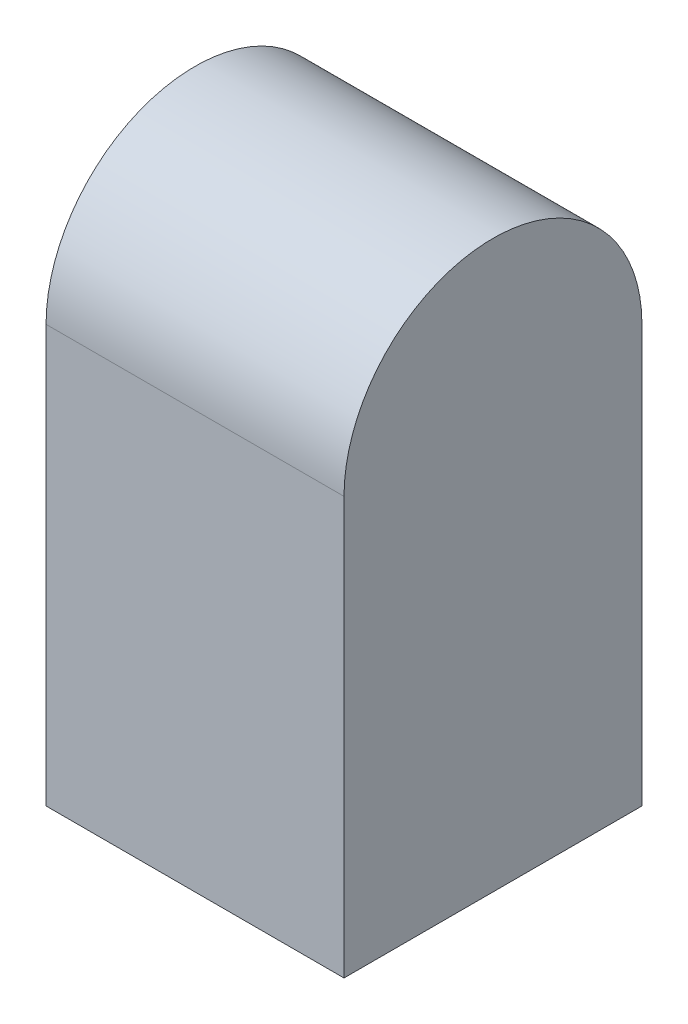
ISO-10303-21;
HEADER;
FILE_DESCRIPTION(('STEP AP214'),'2;1');
FILE_NAME('part.step','',(''),(''),'','','');
FILE_SCHEMA(('AUTOMOTIVE_DESIGN { 1 0 10303 214 1 1 1 1 }'));
ENDSEC;
DATA;
#1=APPLICATION_CONTEXT('core data for automotive mechanical design processes');
#2=APPLICATION_PROTOCOL_DEFINITION('international standard','automotive_design',2000,#1);
#3=PRODUCT_CONTEXT('',#1,'mechanical');
#4=PRODUCT('Part','Part','',(#3));
#5=PRODUCT_RELATED_PRODUCT_CATEGORY('part','',(#4));
#6=PRODUCT_DEFINITION_FORMATION('','',#4);
#7=PRODUCT_DEFINITION_CONTEXT('part definition',#1,'design');
#8=PRODUCT_DEFINITION('design','',#6,#7);
#9=PRODUCT_DEFINITION_SHAPE('','',#8);
#10=(LENGTH_UNIT() NAMED_UNIT(*) SI_UNIT(.MILLI.,.METRE.));
#11=(NAMED_UNIT(*) PLANE_ANGLE_UNIT() SI_UNIT($,.RADIAN.));
#12=(NAMED_UNIT(*) SI_UNIT($,.STERADIAN.) SOLID_ANGLE_UNIT());
#13=UNCERTAINTY_MEASURE_WITH_UNIT(LENGTH_MEASURE(1.E-05),#10,'distance_accuracy_value','');
#14=(GEOMETRIC_REPRESENTATION_CONTEXT(3) GLOBAL_UNCERTAINTY_ASSIGNED_CONTEXT((#13)) GLOBAL_UNIT_ASSIGNED_CONTEXT((#10,
#11,#12)) REPRESENTATION_CONTEXT('',''));
#15=CARTESIAN_POINT('',(0.,0.,0.));
#16=DIRECTION('',(0.,0.,1.));
#17=DIRECTION('',(1.,0.,0.));
#18=AXIS2_PLACEMENT_3D('',#15,#16,#17);
#19=CARTESIAN_POINT('',(-12.5,35.,-12.5));
#20=DIRECTION('',(1.,0.,0.));
#21=DIRECTION('',(0.,0.,-1.));
#22=AXIS2_PLACEMENT_3D('',#19,#20,#21);
#23=PLANE('',#22);
#24=DIRECTION('',(0.,0.,1.));
#25=VECTOR('',#24,1.);
#26=CARTESIAN_POINT('',(-12.5,0.,-12.5));
#27=LINE('',#26,#25);
#28=CARTESIAN_POINT('',(-12.5,0.,-12.5));
#29=VERTEX_POINT('',#28);
#30=CARTESIAN_POINT('',(-12.5,0.,12.5));
#31=VERTEX_POINT('',#30);
#32=EDGE_CURVE('E104',#29,#31,#27,.T.);
#33=ORIENTED_EDGE('',*,*,#32,.T.);
#34=DIRECTION('',(0.,-1.,0.));
#35=VECTOR('',#34,1.);
#36=CARTESIAN_POINT('',(-12.5,35.,12.5));
#37=LINE('',#36,#35);
#38=CARTESIAN_POINT('',(-12.5,35.,12.5));
#39=VERTEX_POINT('',#38);
#40=EDGE_CURVE('E11',#39,#31,#37,.T.);
#41=ORIENTED_EDGE('',*,*,#40,.F.);
#42=CARTESIAN_POINT('',(-12.5,35.,0.));
#43=DIRECTION('',(1.,0.,0.));
#44=DIRECTION('',(0.,0.,-1.));
#45=AXIS2_PLACEMENT_3D('',#42,#43,#44);
#46=CIRCLE('',#45,12.5);
#47=CARTESIAN_POINT('',(-12.5,35.,-12.5));
#48=VERTEX_POINT('',#47);
#49=EDGE_CURVE('E101',#48,#39,#46,.T.);
#50=ORIENTED_EDGE('',*,*,#49,.F.);
#51=DIRECTION('',(0.,-1.,0.));
#52=VECTOR('',#51,1.);
#53=CARTESIAN_POINT('',(-12.5,35.,-12.5));
#54=LINE('',#53,#52);
#55=EDGE_CURVE('E56',#48,#29,#54,.T.);
#56=ORIENTED_EDGE('',*,*,#55,.T.);
#57=EDGE_LOOP('',(#33,#41,#50,#56));
#58=FACE_BOUND('',#57,.T.);
#59=ADVANCED_FACE('F39',(#58),#23,.F.);
#60=CARTESIAN_POINT('',(-12.5,35.,12.5));
#61=DIRECTION('',(0.,0.,-1.));
#62=DIRECTION('',(-1.,0.,0.));
#63=AXIS2_PLACEMENT_3D('',#60,#61,#62);
#64=PLANE('',#63);
#65=DIRECTION('',(1.,0.,0.));
#66=VECTOR('',#65,1.);
#67=CARTESIAN_POINT('',(-12.5,0.,12.5));
#68=LINE('',#67,#66);
#69=CARTESIAN_POINT('',(12.5,0.,12.5));
#70=VERTEX_POINT('',#69);
#71=EDGE_CURVE('E112',#31,#70,#68,.T.);
#72=ORIENTED_EDGE('',*,*,#71,.T.);
#73=DIRECTION('',(0.,-1.,0.));
#74=VECTOR('',#73,1.);
#75=CARTESIAN_POINT('',(12.5,35.,12.5));
#76=LINE('',#75,#74);
#77=CARTESIAN_POINT('',(12.5,35.,12.5));
#78=VERTEX_POINT('',#77);
#79=EDGE_CURVE('E48',#78,#70,#76,.T.);
#80=ORIENTED_EDGE('',*,*,#79,.F.);
#81=DIRECTION('',(1.,0.,0.));
#82=VECTOR('',#81,1.);
#83=CARTESIAN_POINT('',(-12.5,35.,12.5));
#84=LINE('',#83,#82);
#85=EDGE_CURVE('E82',#39,#78,#84,.T.);
#86=ORIENTED_EDGE('',*,*,#85,.F.);
#87=ORIENTED_EDGE('',*,*,#40,.T.);
#88=EDGE_LOOP('',(#72,#80,#86,#87));
#89=FACE_BOUND('',#88,.T.);
#90=ADVANCED_FACE('F125',(#89),#64,.F.);
#91=CARTESIAN_POINT('',(12.5,35.,-12.5));
#92=DIRECTION('',(-1.,0.,0.));
#93=DIRECTION('',(0.,0.,1.));
#94=AXIS2_PLACEMENT_3D('',#91,#92,#93);
#95=PLANE('',#94);
#96=DIRECTION('',(0.,0.,-1.));
#97=VECTOR('',#96,1.);
#98=CARTESIAN_POINT('',(12.5,0.,-12.5));
#99=LINE('',#98,#97);
#100=CARTESIAN_POINT('',(12.5,0.,-12.5));
#101=VERTEX_POINT('',#100);
#102=EDGE_CURVE('E75',#70,#101,#99,.T.);
#103=ORIENTED_EDGE('',*,*,#102,.T.);
#104=DIRECTION('',(0.,-1.,0.));
#105=VECTOR('',#104,1.);
#106=CARTESIAN_POINT('',(12.5,35.,-12.5));
#107=LINE('',#106,#105);
#108=CARTESIAN_POINT('',(12.5,35.,-12.5));
#109=VERTEX_POINT('',#108);
#110=EDGE_CURVE('E87',#109,#101,#107,.T.);
#111=ORIENTED_EDGE('',*,*,#110,.F.);
#112=CARTESIAN_POINT('',(12.5,35.,0.));
#113=DIRECTION('',(1.,0.,0.));
#114=DIRECTION('',(0.,0.,-1.));
#115=AXIS2_PLACEMENT_3D('',#112,#113,#114);
#116=CIRCLE('',#115,12.5);
#117=EDGE_CURVE('E96',#109,#78,#116,.T.);
#118=ORIENTED_EDGE('',*,*,#117,.T.);
#119=ORIENTED_EDGE('',*,*,#79,.T.);
#120=EDGE_LOOP('',(#103,#111,#118,#119));
#121=FACE_BOUND('',#120,.T.);
#122=ADVANCED_FACE('F95',(#121),#95,.F.);
#123=CARTESIAN_POINT('',(-12.5,35.,-12.5));
#124=DIRECTION('',(0.,0.,1.));
#125=DIRECTION('',(1.,0.,0.));
#126=AXIS2_PLACEMENT_3D('',#123,#124,#125);
#127=PLANE('',#126);
#128=DIRECTION('',(-1.,0.,0.));
#129=VECTOR('',#128,1.);
#130=CARTESIAN_POINT('',(-12.5,0.,-12.5));
#131=LINE('',#130,#129);
#132=EDGE_CURVE('E78',#101,#29,#131,.T.);
#133=ORIENTED_EDGE('',*,*,#132,.T.);
#134=ORIENTED_EDGE('',*,*,#55,.F.);
#135=DIRECTION('',(-1.,0.,0.));
#136=VECTOR('',#135,1.);
#137=CARTESIAN_POINT('',(-12.5,35.,-12.5));
#138=LINE('',#137,#136);
#139=EDGE_CURVE('E85',#109,#48,#138,.T.);
#140=ORIENTED_EDGE('',*,*,#139,.F.);
#141=ORIENTED_EDGE('',*,*,#110,.T.);
#142=EDGE_LOOP('',(#133,#134,#140,#141));
#143=FACE_BOUND('',#142,.T.);
#144=ADVANCED_FACE('F86',(#143),#127,.F.);
#145=CARTESIAN_POINT('',(0.,0.,0.));
#146=DIRECTION('',(0.,1.,0.));
#147=DIRECTION('',(0.,0.,1.));
#148=AXIS2_PLACEMENT_3D('',#145,#146,#147);
#149=PLANE('',#148);
#150=ORIENTED_EDGE('',*,*,#32,.F.);
#151=ORIENTED_EDGE('',*,*,#132,.F.);
#152=ORIENTED_EDGE('',*,*,#102,.F.);
#153=ORIENTED_EDGE('',*,*,#71,.F.);
#154=EDGE_LOOP('',(#150,#151,#152,#153));
#155=FACE_BOUND('',#154,.T.);
#156=ADVANCED_FACE('F123',(#155),#149,.F.);
#157=CARTESIAN_POINT('',(-12.5,35.,0.));
#158=DIRECTION('',(1.,0.,0.));
#159=DIRECTION('',(0.,0.,-1.));
#160=AXIS2_PLACEMENT_3D('',#157,#158,#159);
#161=CYLINDRICAL_SURFACE('',#160,12.5);
#162=ORIENTED_EDGE('',*,*,#117,.F.);
#163=ORIENTED_EDGE('',*,*,#139,.T.);
#164=ORIENTED_EDGE('',*,*,#49,.T.);
#165=ORIENTED_EDGE('',*,*,#85,.T.);
#166=EDGE_LOOP('',(#162,#163,#164,#165));
#167=FACE_BOUND('',#166,.T.);
#168=ADVANCED_FACE('F99',(#167),#161,.T.);
#169=CLOSED_SHELL('',(#59,#90,#122,#144,#156,#168));
#170=MANIFOLD_SOLID_BREP('B2',#169);
#171=ADVANCED_BREP_SHAPE_REPRESENTATION('',(#18,#170),#14);
#172=SHAPE_DEFINITION_REPRESENTATION(#9,#171);
ENDSEC;
END-ISO-10303-21;
